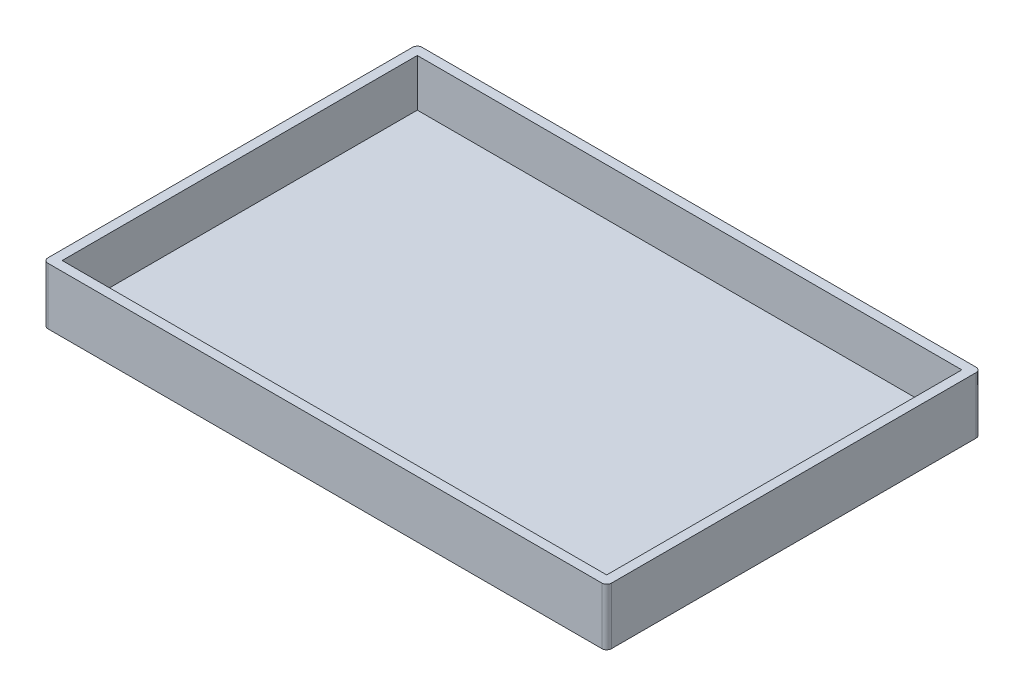
ISO-10303-21;
HEADER;
FILE_DESCRIPTION(('STEP AP214'),'2;1');
FILE_NAME('part.step','',(''),(''),'','','');
FILE_SCHEMA(('AUTOMOTIVE_DESIGN { 1 0 10303 214 1 1 1 1 }'));
ENDSEC;
DATA;
#1=APPLICATION_CONTEXT('core data for automotive mechanical design processes');
#2=APPLICATION_PROTOCOL_DEFINITION('international standard','automotive_design',2000,#1);
#3=PRODUCT_CONTEXT('',#1,'mechanical');
#4=PRODUCT('Part','Part','',(#3));
#5=PRODUCT_RELATED_PRODUCT_CATEGORY('part','',(#4));
#6=PRODUCT_DEFINITION_FORMATION('','',#4);
#7=PRODUCT_DEFINITION_CONTEXT('part definition',#1,'design');
#8=PRODUCT_DEFINITION('design','',#6,#7);
#9=PRODUCT_DEFINITION_SHAPE('','',#8);
#10=(LENGTH_UNIT() NAMED_UNIT(*) SI_UNIT(.MILLI.,.METRE.));
#11=(NAMED_UNIT(*) PLANE_ANGLE_UNIT() SI_UNIT($,.RADIAN.));
#12=(NAMED_UNIT(*) SI_UNIT($,.STERADIAN.) SOLID_ANGLE_UNIT());
#13=UNCERTAINTY_MEASURE_WITH_UNIT(LENGTH_MEASURE(1.E-05),#10,'distance_accuracy_value','');
#14=(GEOMETRIC_REPRESENTATION_CONTEXT(3) GLOBAL_UNCERTAINTY_ASSIGNED_CONTEXT((#13)) GLOBAL_UNIT_ASSIGNED_CONTEXT((#10,
#11,#12)) REPRESENTATION_CONTEXT('',''));
#15=CARTESIAN_POINT('',(0.,0.,0.));
#16=DIRECTION('',(0.,0.,1.));
#17=DIRECTION('',(1.,0.,0.));
#18=AXIS2_PLACEMENT_3D('',#15,#16,#17);
#19=CARTESIAN_POINT('',(0.,10.,0.));
#20=DIRECTION('',(0.,-1.,0.));
#21=DIRECTION('',(0.,0.,-1.));
#22=AXIS2_PLACEMENT_3D('',#19,#20,#21);
#23=PLANE('',#22);
#24=DIRECTION('',(-1.,0.,0.));
#25=VECTOR('',#24,1.);
#26=CARTESIAN_POINT('',(0.,10.,-39.5));
#27=LINE('',#26,#25);
#28=CARTESIAN_POINT('',(58.5,10.,-39.5));
#29=VERTEX_POINT('',#28);
#30=CARTESIAN_POINT('',(-58.5,10.,-39.5));
#31=VERTEX_POINT('',#30);
#32=EDGE_CURVE('E177',#29,#31,#27,.T.);
#33=ORIENTED_EDGE('',*,*,#32,.T.);
#34=CARTESIAN_POINT('',(-58.5,10.,-38.5));
#35=DIRECTION('',(0.,-1.,0.));
#36=DIRECTION('',(0.,0.,-1.));
#37=AXIS2_PLACEMENT_3D('',#34,#35,#36);
#38=CIRCLE('',#37,1.);
#39=CARTESIAN_POINT('',(-59.5,10.,-38.5));
#40=VERTEX_POINT('',#39);
#41=EDGE_CURVE('E207',#31,#40,#38,.F.);
#42=ORIENTED_EDGE('',*,*,#41,.T.);
#43=DIRECTION('',(0.,0.,1.));
#44=VECTOR('',#43,1.);
#45=CARTESIAN_POINT('',(-59.5,10.,0.));
#46=LINE('',#45,#44);
#47=CARTESIAN_POINT('',(-59.5,10.,38.5));
#48=VERTEX_POINT('',#47);
#49=EDGE_CURVE('E180',#40,#48,#46,.T.);
#50=ORIENTED_EDGE('',*,*,#49,.T.);
#51=CARTESIAN_POINT('',(-58.5,10.,38.5));
#52=DIRECTION('',(0.,-1.,0.));
#53=DIRECTION('',(0.,0.,-1.));
#54=AXIS2_PLACEMENT_3D('',#51,#52,#53);
#55=CIRCLE('',#54,1.);
#56=CARTESIAN_POINT('',(-58.5,10.,39.5));
#57=VERTEX_POINT('',#56);
#58=EDGE_CURVE('E53',#48,#57,#55,.F.);
#59=ORIENTED_EDGE('',*,*,#58,.T.);
#60=DIRECTION('',(1.,0.,0.));
#61=VECTOR('',#60,1.);
#62=CARTESIAN_POINT('',(0.,10.,39.5));
#63=LINE('',#62,#61);
#64=CARTESIAN_POINT('',(58.5,10.,39.5));
#65=VERTEX_POINT('',#64);
#66=EDGE_CURVE('E182',#57,#65,#63,.T.);
#67=ORIENTED_EDGE('',*,*,#66,.T.);
#68=CARTESIAN_POINT('',(58.5,10.,38.5));
#69=DIRECTION('',(0.,-1.,0.));
#70=DIRECTION('',(0.,0.,-1.));
#71=AXIS2_PLACEMENT_3D('',#68,#69,#70);
#72=CIRCLE('',#71,1.);
#73=CARTESIAN_POINT('',(59.5,10.,38.5));
#74=VERTEX_POINT('',#73);
#75=EDGE_CURVE('E205',#65,#74,#72,.F.);
#76=ORIENTED_EDGE('',*,*,#75,.T.);
#77=DIRECTION('',(0.,0.,-1.));
#78=VECTOR('',#77,1.);
#79=CARTESIAN_POINT('',(59.5,10.,0.));
#80=LINE('',#79,#78);
#81=CARTESIAN_POINT('',(59.5,10.,-38.5));
#82=VERTEX_POINT('',#81);
#83=EDGE_CURVE('E174',#74,#82,#80,.T.);
#84=ORIENTED_EDGE('',*,*,#83,.T.);
#85=CARTESIAN_POINT('',(58.5,10.,-38.5));
#86=DIRECTION('',(0.,-1.,0.));
#87=DIRECTION('',(0.,0.,-1.));
#88=AXIS2_PLACEMENT_3D('',#85,#86,#87);
#89=CIRCLE('',#88,1.);
#90=EDGE_CURVE('E203',#82,#29,#89,.F.);
#91=ORIENTED_EDGE('',*,*,#90,.T.);
#92=EDGE_LOOP('',(#33,#42,#50,#59,#67,#76,#84,#91));
#93=FACE_BOUND('',#92,.T.);
#94=DIRECTION('',(0.,0.,-1.));
#95=VECTOR('',#94,1.);
#96=CARTESIAN_POINT('',(57.5,10.,37.5));
#97=LINE('',#96,#95);
#98=CARTESIAN_POINT('',(57.5,10.,37.5));
#99=VERTEX_POINT('',#98);
#100=CARTESIAN_POINT('',(57.5,10.,-37.5));
#101=VERTEX_POINT('',#100);
#102=EDGE_CURVE('E123',#99,#101,#97,.T.);
#103=ORIENTED_EDGE('',*,*,#102,.F.);
#104=DIRECTION('',(1.,0.,0.));
#105=VECTOR('',#104,1.);
#106=CARTESIAN_POINT('',(-57.5,10.,37.5));
#107=LINE('',#106,#105);
#108=CARTESIAN_POINT('',(-57.5,10.,37.5));
#109=VERTEX_POINT('',#108);
#110=EDGE_CURVE('E149',#109,#99,#107,.T.);
#111=ORIENTED_EDGE('',*,*,#110,.F.);
#112=DIRECTION('',(0.,0.,1.));
#113=VECTOR('',#112,1.);
#114=CARTESIAN_POINT('',(-57.5,10.,37.5));
#115=LINE('',#114,#113);
#116=CARTESIAN_POINT('',(-57.5,10.,-37.5));
#117=VERTEX_POINT('',#116);
#118=EDGE_CURVE('E147',#117,#109,#115,.T.);
#119=ORIENTED_EDGE('',*,*,#118,.F.);
#120=DIRECTION('',(-1.,0.,0.));
#121=VECTOR('',#120,1.);
#122=CARTESIAN_POINT('',(-57.5,10.,-37.5));
#123=LINE('',#122,#121);
#124=EDGE_CURVE('E134',#101,#117,#123,.T.);
#125=ORIENTED_EDGE('',*,*,#124,.F.);
#126=EDGE_LOOP('',(#103,#111,#119,#125));
#127=FACE_BOUND('',#126,.T.);
#128=ADVANCED_FACE('F33',(#93,#127),#23,.F.);
#129=CARTESIAN_POINT('',(59.5,10.,37.5));
#130=DIRECTION('',(-1.,0.,0.));
#131=DIRECTION('',(0.,0.,1.));
#132=AXIS2_PLACEMENT_3D('',#129,#130,#131);
#133=PLANE('',#132);
#134=ORIENTED_EDGE('',*,*,#83,.F.);
#135=DIRECTION('',(0.,-1.,0.));
#136=VECTOR('',#135,1.);
#137=CARTESIAN_POINT('',(59.5,10.,38.5));
#138=LINE('',#137,#136);
#139=CARTESIAN_POINT('',(59.5,-2.,38.5));
#140=VERTEX_POINT('',#139);
#141=EDGE_CURVE('E211',#74,#140,#138,.T.);
#142=ORIENTED_EDGE('',*,*,#141,.T.);
#143=DIRECTION('',(0.,0.,-1.));
#144=VECTOR('',#143,1.);
#145=CARTESIAN_POINT('',(59.5,-2.,0.));
#146=LINE('',#145,#144);
#147=CARTESIAN_POINT('',(59.5,-2.,-38.5));
#148=VERTEX_POINT('',#147);
#149=EDGE_CURVE('E142',#140,#148,#146,.T.);
#150=ORIENTED_EDGE('',*,*,#149,.T.);
#151=DIRECTION('',(0.,-1.,0.));
#152=VECTOR('',#151,1.);
#153=CARTESIAN_POINT('',(59.5,10.,-38.5));
#154=LINE('',#153,#152);
#155=EDGE_CURVE('E209',#148,#82,#154,.F.);
#156=ORIENTED_EDGE('',*,*,#155,.T.);
#157=EDGE_LOOP('',(#134,#142,#150,#156));
#158=FACE_BOUND('',#157,.T.);
#159=ADVANCED_FACE('F228',(#158),#133,.F.);
#160=CARTESIAN_POINT('',(-57.5,10.,-39.5));
#161=DIRECTION('',(0.,0.,1.));
#162=DIRECTION('',(1.,0.,0.));
#163=AXIS2_PLACEMENT_3D('',#160,#161,#162);
#164=PLANE('',#163);
#165=DIRECTION('',(-1.,0.,0.));
#166=VECTOR('',#165,1.);
#167=CARTESIAN_POINT('',(0.,-2.,-39.5));
#168=LINE('',#167,#166);
#169=CARTESIAN_POINT('',(58.5,-2.,-39.5));
#170=VERTEX_POINT('',#169);
#171=CARTESIAN_POINT('',(-58.5,-2.,-39.5));
#172=VERTEX_POINT('',#171);
#173=EDGE_CURVE('E166',#170,#172,#168,.T.);
#174=ORIENTED_EDGE('',*,*,#173,.T.);
#175=DIRECTION('',(0.,-1.,0.));
#176=VECTOR('',#175,1.);
#177=CARTESIAN_POINT('',(-58.5,10.,-39.5));
#178=LINE('',#177,#176);
#179=EDGE_CURVE('E200',#172,#31,#178,.F.);
#180=ORIENTED_EDGE('',*,*,#179,.T.);
#181=ORIENTED_EDGE('',*,*,#32,.F.);
#182=DIRECTION('',(0.,-1.,0.));
#183=VECTOR('',#182,1.);
#184=CARTESIAN_POINT('',(58.5,10.,-39.5));
#185=LINE('',#184,#183);
#186=EDGE_CURVE('E197',#29,#170,#185,.T.);
#187=ORIENTED_EDGE('',*,*,#186,.T.);
#188=EDGE_LOOP('',(#174,#180,#181,#187));
#189=FACE_BOUND('',#188,.T.);
#190=ADVANCED_FACE('F237',(#189),#164,.F.);
#191=CARTESIAN_POINT('',(-59.5,10.,37.5));
#192=DIRECTION('',(1.,0.,0.));
#193=DIRECTION('',(0.,0.,-1.));
#194=AXIS2_PLACEMENT_3D('',#191,#192,#193);
#195=PLANE('',#194);
#196=ORIENTED_EDGE('',*,*,#49,.F.);
#197=DIRECTION('',(0.,-1.,0.));
#198=VECTOR('',#197,1.);
#199=CARTESIAN_POINT('',(-59.5,10.,-38.5));
#200=LINE('',#199,#198);
#201=CARTESIAN_POINT('',(-59.5,-2.,-38.5));
#202=VERTEX_POINT('',#201);
#203=EDGE_CURVE('E186',#40,#202,#200,.T.);
#204=ORIENTED_EDGE('',*,*,#203,.T.);
#205=DIRECTION('',(0.,0.,1.));
#206=VECTOR('',#205,1.);
#207=CARTESIAN_POINT('',(-59.5,-2.,0.));
#208=LINE('',#207,#206);
#209=CARTESIAN_POINT('',(-59.5,-2.,38.5));
#210=VERTEX_POINT('',#209);
#211=EDGE_CURVE('E169',#202,#210,#208,.T.);
#212=ORIENTED_EDGE('',*,*,#211,.T.);
#213=DIRECTION('',(0.,-1.,0.));
#214=VECTOR('',#213,1.);
#215=CARTESIAN_POINT('',(-59.5,10.,38.5));
#216=LINE('',#215,#214);
#217=EDGE_CURVE('E184',#210,#48,#216,.F.);
#218=ORIENTED_EDGE('',*,*,#217,.T.);
#219=EDGE_LOOP('',(#196,#204,#212,#218));
#220=FACE_BOUND('',#219,.T.);
#221=ADVANCED_FACE('F245',(#220),#195,.F.);
#222=CARTESIAN_POINT('',(-57.5,10.,39.5));
#223=DIRECTION('',(0.,0.,-1.));
#224=DIRECTION('',(-1.,0.,0.));
#225=AXIS2_PLACEMENT_3D('',#222,#223,#224);
#226=PLANE('',#225);
#227=DIRECTION('',(1.,0.,0.));
#228=VECTOR('',#227,1.);
#229=CARTESIAN_POINT('',(0.,-2.,39.5));
#230=LINE('',#229,#228);
#231=CARTESIAN_POINT('',(-58.5,-2.,39.5));
#232=VERTEX_POINT('',#231);
#233=CARTESIAN_POINT('',(58.5,-2.,39.5));
#234=VERTEX_POINT('',#233);
#235=EDGE_CURVE('E172',#232,#234,#230,.T.);
#236=ORIENTED_EDGE('',*,*,#235,.T.);
#237=DIRECTION('',(0.,-1.,0.));
#238=VECTOR('',#237,1.);
#239=CARTESIAN_POINT('',(58.5,10.,39.5));
#240=LINE('',#239,#238);
#241=EDGE_CURVE('E11',#234,#65,#240,.F.);
#242=ORIENTED_EDGE('',*,*,#241,.T.);
#243=ORIENTED_EDGE('',*,*,#66,.F.);
#244=DIRECTION('',(0.,-1.,0.));
#245=VECTOR('',#244,1.);
#246=CARTESIAN_POINT('',(-58.5,10.,39.5));
#247=LINE('',#246,#245);
#248=EDGE_CURVE('E41',#57,#232,#247,.T.);
#249=ORIENTED_EDGE('',*,*,#248,.T.);
#250=EDGE_LOOP('',(#236,#242,#243,#249));
#251=FACE_BOUND('',#250,.T.);
#252=ADVANCED_FACE('F216',(#251),#226,.F.);
#253=CARTESIAN_POINT('',(0.,-2.,0.));
#254=DIRECTION('',(0.,-1.,0.));
#255=DIRECTION('',(0.,0.,-1.));
#256=AXIS2_PLACEMENT_3D('',#253,#254,#255);
#257=PLANE('',#256);
#258=ORIENTED_EDGE('',*,*,#211,.F.);
#259=CARTESIAN_POINT('',(-58.5,-2.,-38.5));
#260=DIRECTION('',(0.,-1.,0.));
#261=DIRECTION('',(0.,0.,-1.));
#262=AXIS2_PLACEMENT_3D('',#259,#260,#261);
#263=CIRCLE('',#262,1.);
#264=EDGE_CURVE('E195',#202,#172,#263,.T.);
#265=ORIENTED_EDGE('',*,*,#264,.T.);
#266=ORIENTED_EDGE('',*,*,#173,.F.);
#267=CARTESIAN_POINT('',(58.5,-2.,-38.5));
#268=DIRECTION('',(0.,-1.,0.));
#269=DIRECTION('',(0.,0.,-1.));
#270=AXIS2_PLACEMENT_3D('',#267,#268,#269);
#271=CIRCLE('',#270,1.);
#272=EDGE_CURVE('E191',#170,#148,#271,.T.);
#273=ORIENTED_EDGE('',*,*,#272,.T.);
#274=ORIENTED_EDGE('',*,*,#149,.F.);
#275=CARTESIAN_POINT('',(58.5,-2.,38.5));
#276=DIRECTION('',(0.,-1.,0.));
#277=DIRECTION('',(0.,0.,-1.));
#278=AXIS2_PLACEMENT_3D('',#275,#276,#277);
#279=CIRCLE('',#278,1.);
#280=EDGE_CURVE('E193',#140,#234,#279,.T.);
#281=ORIENTED_EDGE('',*,*,#280,.T.);
#282=ORIENTED_EDGE('',*,*,#235,.F.);
#283=CARTESIAN_POINT('',(-58.5,-2.,38.5));
#284=DIRECTION('',(0.,-1.,0.));
#285=DIRECTION('',(0.,0.,-1.));
#286=AXIS2_PLACEMENT_3D('',#283,#284,#285);
#287=CIRCLE('',#286,1.);
#288=EDGE_CURVE('E189',#232,#210,#287,.T.);
#289=ORIENTED_EDGE('',*,*,#288,.T.);
#290=EDGE_LOOP('',(#258,#265,#266,#273,#274,#281,#282,#289));
#291=FACE_BOUND('',#290,.T.);
#292=ADVANCED_FACE('F220',(#291),#257,.T.);
#293=CARTESIAN_POINT('',(57.5,10.,37.5));
#294=DIRECTION('',(-1.,0.,0.));
#295=DIRECTION('',(0.,0.,1.));
#296=AXIS2_PLACEMENT_3D('',#293,#294,#295);
#297=PLANE('',#296);
#298=DIRECTION('',(0.,0.,-1.));
#299=VECTOR('',#298,1.);
#300=CARTESIAN_POINT('',(57.5,0.,37.5));
#301=LINE('',#300,#299);
#302=CARTESIAN_POINT('',(57.5,0.,37.5));
#303=VERTEX_POINT('',#302);
#304=CARTESIAN_POINT('',(57.5,0.,-37.5));
#305=VERTEX_POINT('',#304);
#306=EDGE_CURVE('E153',#303,#305,#301,.T.);
#307=ORIENTED_EDGE('',*,*,#306,.F.);
#308=DIRECTION('',(0.,-1.,0.));
#309=VECTOR('',#308,1.);
#310=CARTESIAN_POINT('',(57.5,10.,37.5));
#311=LINE('',#310,#309);
#312=EDGE_CURVE('E130',#99,#303,#311,.T.);
#313=ORIENTED_EDGE('',*,*,#312,.F.);
#314=ORIENTED_EDGE('',*,*,#102,.T.);
#315=DIRECTION('',(0.,-1.,0.));
#316=VECTOR('',#315,1.);
#317=CARTESIAN_POINT('',(57.5,10.,-37.5));
#318=LINE('',#317,#316);
#319=EDGE_CURVE('E127',#101,#305,#318,.T.);
#320=ORIENTED_EDGE('',*,*,#319,.T.);
#321=EDGE_LOOP('',(#307,#313,#314,#320));
#322=FACE_BOUND('',#321,.T.);
#323=ADVANCED_FACE('F126',(#322),#297,.T.);
#324=CARTESIAN_POINT('',(-57.5,10.,-37.5));
#325=DIRECTION('',(0.,0.,1.));
#326=DIRECTION('',(1.,0.,0.));
#327=AXIS2_PLACEMENT_3D('',#324,#325,#326);
#328=PLANE('',#327);
#329=DIRECTION('',(-1.,0.,0.));
#330=VECTOR('',#329,1.);
#331=CARTESIAN_POINT('',(-57.5,0.,-37.5));
#332=LINE('',#331,#330);
#333=CARTESIAN_POINT('',(-57.5,0.,-37.5));
#334=VERTEX_POINT('',#333);
#335=EDGE_CURVE('E141',#305,#334,#332,.T.);
#336=ORIENTED_EDGE('',*,*,#335,.F.);
#337=ORIENTED_EDGE('',*,*,#319,.F.);
#338=ORIENTED_EDGE('',*,*,#124,.T.);
#339=DIRECTION('',(0.,-1.,0.));
#340=VECTOR('',#339,1.);
#341=CARTESIAN_POINT('',(-57.5,10.,-37.5));
#342=LINE('',#341,#340);
#343=EDGE_CURVE('E143',#117,#334,#342,.T.);
#344=ORIENTED_EDGE('',*,*,#343,.T.);
#345=EDGE_LOOP('',(#336,#337,#338,#344));
#346=FACE_BOUND('',#345,.T.);
#347=ADVANCED_FACE('F138',(#346),#328,.T.);
#348=CARTESIAN_POINT('',(-57.5,10.,37.5));
#349=DIRECTION('',(1.,0.,0.));
#350=DIRECTION('',(0.,0.,-1.));
#351=AXIS2_PLACEMENT_3D('',#348,#349,#350);
#352=PLANE('',#351);
#353=DIRECTION('',(0.,0.,1.));
#354=VECTOR('',#353,1.);
#355=CARTESIAN_POINT('',(-57.5,0.,37.5));
#356=LINE('',#355,#354);
#357=CARTESIAN_POINT('',(-57.5,0.,37.5));
#358=VERTEX_POINT('',#357);
#359=EDGE_CURVE('E156',#334,#358,#356,.T.);
#360=ORIENTED_EDGE('',*,*,#359,.F.);
#361=ORIENTED_EDGE('',*,*,#343,.F.);
#362=ORIENTED_EDGE('',*,*,#118,.T.);
#363=DIRECTION('',(0.,-1.,0.));
#364=VECTOR('',#363,1.);
#365=CARTESIAN_POINT('',(-57.5,10.,37.5));
#366=LINE('',#365,#364);
#367=EDGE_CURVE('E160',#109,#358,#366,.T.);
#368=ORIENTED_EDGE('',*,*,#367,.T.);
#369=EDGE_LOOP('',(#360,#361,#362,#368));
#370=FACE_BOUND('',#369,.T.);
#371=ADVANCED_FACE('F334',(#370),#352,.T.);
#372=CARTESIAN_POINT('',(-57.5,10.,37.5));
#373=DIRECTION('',(0.,0.,-1.));
#374=DIRECTION('',(-1.,0.,0.));
#375=AXIS2_PLACEMENT_3D('',#372,#373,#374);
#376=PLANE('',#375);
#377=DIRECTION('',(1.,0.,0.));
#378=VECTOR('',#377,1.);
#379=CARTESIAN_POINT('',(-57.5,0.,37.5));
#380=LINE('',#379,#378);
#381=EDGE_CURVE('E135',#358,#303,#380,.T.);
#382=ORIENTED_EDGE('',*,*,#381,.F.);
#383=ORIENTED_EDGE('',*,*,#367,.F.);
#384=ORIENTED_EDGE('',*,*,#110,.T.);
#385=ORIENTED_EDGE('',*,*,#312,.T.);
#386=EDGE_LOOP('',(#382,#383,#384,#385));
#387=FACE_BOUND('',#386,.T.);
#388=ADVANCED_FACE('F325',(#387),#376,.T.);
#389=CARTESIAN_POINT('',(0.,0.,0.));
#390=DIRECTION('',(0.,-1.,0.));
#391=DIRECTION('',(0.,0.,-1.));
#392=AXIS2_PLACEMENT_3D('',#389,#390,#391);
#393=PLANE('',#392);
#394=ORIENTED_EDGE('',*,*,#306,.T.);
#395=ORIENTED_EDGE('',*,*,#335,.T.);
#396=ORIENTED_EDGE('',*,*,#359,.T.);
#397=ORIENTED_EDGE('',*,*,#381,.T.);
#398=EDGE_LOOP('',(#394,#395,#396,#397));
#399=FACE_BOUND('',#398,.T.);
#400=ADVANCED_FACE('F270',(#399),#393,.F.);
#401=CARTESIAN_POINT('',(-58.5,10.,-38.5));
#402=DIRECTION('',(0.,-1.,0.));
#403=DIRECTION('',(0.,0.,-1.));
#404=AXIS2_PLACEMENT_3D('',#401,#402,#403);
#405=CYLINDRICAL_SURFACE('',#404,1.);
#406=ORIENTED_EDGE('',*,*,#41,.F.);
#407=ORIENTED_EDGE('',*,*,#179,.F.);
#408=ORIENTED_EDGE('',*,*,#264,.F.);
#409=ORIENTED_EDGE('',*,*,#203,.F.);
#410=EDGE_LOOP('',(#406,#407,#408,#409));
#411=FACE_BOUND('',#410,.T.);
#412=ADVANCED_FACE('F242',(#411),#405,.T.);
#413=CARTESIAN_POINT('',(58.5,10.,38.5));
#414=DIRECTION('',(0.,-1.,0.));
#415=DIRECTION('',(0.,0.,-1.));
#416=AXIS2_PLACEMENT_3D('',#413,#414,#415);
#417=CYLINDRICAL_SURFACE('',#416,1.);
#418=ORIENTED_EDGE('',*,*,#75,.F.);
#419=ORIENTED_EDGE('',*,*,#241,.F.);
#420=ORIENTED_EDGE('',*,*,#280,.F.);
#421=ORIENTED_EDGE('',*,*,#141,.F.);
#422=EDGE_LOOP('',(#418,#419,#420,#421));
#423=FACE_BOUND('',#422,.T.);
#424=ADVANCED_FACE('F225',(#423),#417,.T.);
#425=CARTESIAN_POINT('',(58.5,10.,-38.5));
#426=DIRECTION('',(0.,-1.,0.));
#427=DIRECTION('',(0.,0.,-1.));
#428=AXIS2_PLACEMENT_3D('',#425,#426,#427);
#429=CYLINDRICAL_SURFACE('',#428,1.);
#430=ORIENTED_EDGE('',*,*,#90,.F.);
#431=ORIENTED_EDGE('',*,*,#155,.F.);
#432=ORIENTED_EDGE('',*,*,#272,.F.);
#433=ORIENTED_EDGE('',*,*,#186,.F.);
#434=EDGE_LOOP('',(#430,#431,#432,#433));
#435=FACE_BOUND('',#434,.T.);
#436=ADVANCED_FACE('F234',(#435),#429,.T.);
#437=CARTESIAN_POINT('',(-58.5,10.,38.5));
#438=DIRECTION('',(0.,-1.,0.));
#439=DIRECTION('',(0.,0.,-1.));
#440=AXIS2_PLACEMENT_3D('',#437,#438,#439);
#441=CYLINDRICAL_SURFACE('',#440,1.);
#442=ORIENTED_EDGE('',*,*,#58,.F.);
#443=ORIENTED_EDGE('',*,*,#217,.F.);
#444=ORIENTED_EDGE('',*,*,#288,.F.);
#445=ORIENTED_EDGE('',*,*,#248,.F.);
#446=EDGE_LOOP('',(#442,#443,#444,#445));
#447=FACE_BOUND('',#446,.T.);
#448=ADVANCED_FACE('F35',(#447),#441,.T.);
#449=CLOSED_SHELL('',(#128,#159,#190,#221,#252,#292,#323,#347,#371,#388,#400,#412,#424,#436,#448));
#450=MANIFOLD_SOLID_BREP('B2',#449);
#451=ADVANCED_BREP_SHAPE_REPRESENTATION('',(#18,#450),#14);
#452=SHAPE_DEFINITION_REPRESENTATION(#9,#451);
ENDSEC;
END-ISO-10303-21;
